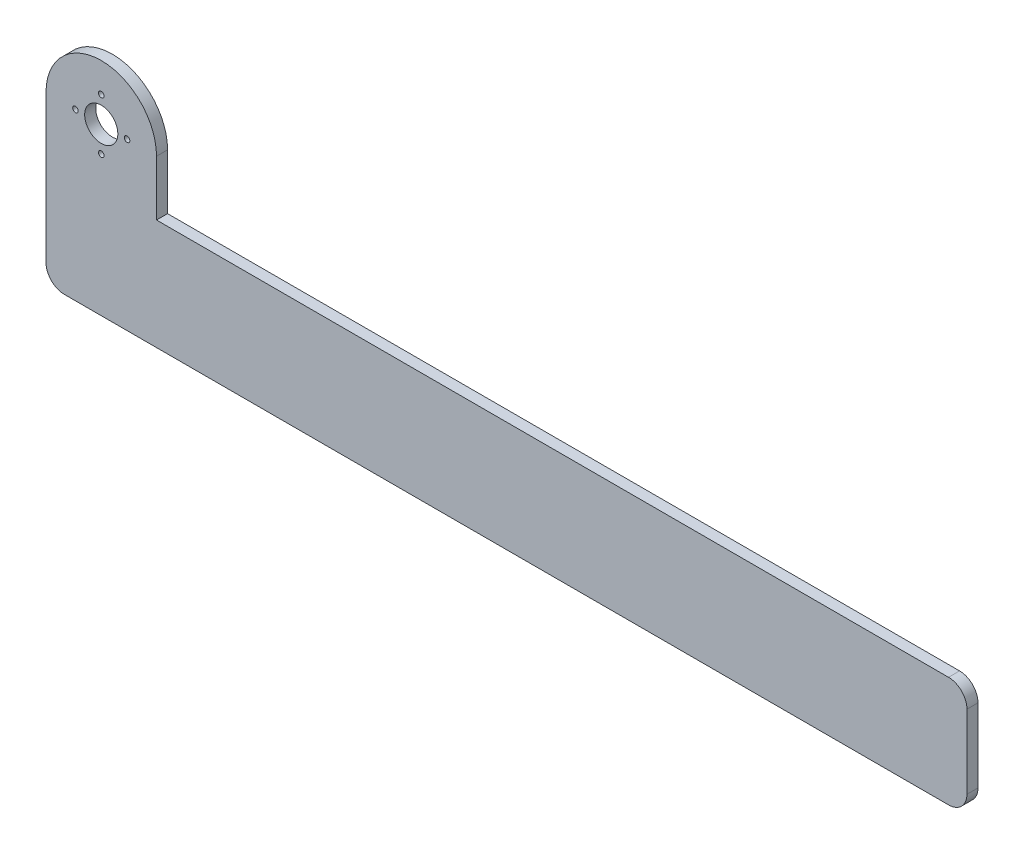
ISO-10303-21;
HEADER;
FILE_DESCRIPTION(('STEP AP214'),'2;1');
FILE_NAME('part.step','',(''),(''),'','','');
FILE_SCHEMA(('AUTOMOTIVE_DESIGN { 1 0 10303 214 1 1 1 1 }'));
ENDSEC;
DATA;
#1=APPLICATION_CONTEXT('core data for automotive mechanical design processes');
#2=APPLICATION_PROTOCOL_DEFINITION('international standard','automotive_design',2000,#1);
#3=PRODUCT_CONTEXT('',#1,'mechanical');
#4=PRODUCT('Part','Part','',(#3));
#5=PRODUCT_RELATED_PRODUCT_CATEGORY('part','',(#4));
#6=PRODUCT_DEFINITION_FORMATION('','',#4);
#7=PRODUCT_DEFINITION_CONTEXT('part definition',#1,'design');
#8=PRODUCT_DEFINITION('design','',#6,#7);
#9=PRODUCT_DEFINITION_SHAPE('','',#8);
#10=(LENGTH_UNIT() NAMED_UNIT(*) SI_UNIT(.MILLI.,.METRE.));
#11=(NAMED_UNIT(*) PLANE_ANGLE_UNIT() SI_UNIT($,.RADIAN.));
#12=(NAMED_UNIT(*) SI_UNIT($,.STERADIAN.) SOLID_ANGLE_UNIT());
#13=UNCERTAINTY_MEASURE_WITH_UNIT(LENGTH_MEASURE(1.E-05),#10,'distance_accuracy_value','');
#14=(GEOMETRIC_REPRESENTATION_CONTEXT(3) GLOBAL_UNCERTAINTY_ASSIGNED_CONTEXT((#13)) GLOBAL_UNIT_ASSIGNED_CONTEXT((#10,
#11,#12)) REPRESENTATION_CONTEXT('',''));
#15=CARTESIAN_POINT('',(0.,0.,0.));
#16=DIRECTION('',(0.,0.,1.));
#17=DIRECTION('',(1.,0.,0.));
#18=AXIS2_PLACEMENT_3D('',#15,#16,#17);
#19=CARTESIAN_POINT('',(30.,-45.,6.));
#20=DIRECTION('',(0.,1.,0.));
#21=DIRECTION('',(-1.,0.,0.));
#22=AXIS2_PLACEMENT_3D('',#19,#20,#21);
#23=PLANE('',#22);
#24=DIRECTION('',(1.,0.,0.));
#25=VECTOR('',#24,1.);
#26=CARTESIAN_POINT('',(30.,-45.,0.));
#27=LINE('',#26,#25);
#28=CARTESIAN_POINT('',(-20.,-45.,0.));
#29=VERTEX_POINT('',#28);
#30=CARTESIAN_POINT('',(460.,-45.,0.));
#31=VERTEX_POINT('',#30);
#32=EDGE_CURVE('E140',#29,#31,#27,.T.);
#33=ORIENTED_EDGE('',*,*,#32,.T.);
#34=DIRECTION('',(0.,0.,-1.));
#35=VECTOR('',#34,1.);
#36=CARTESIAN_POINT('',(460.,-45.,6.));
#37=LINE('',#36,#35);
#38=CARTESIAN_POINT('',(460.,-45.0000000000001,6.));
#39=VERTEX_POINT('',#38);
#40=EDGE_CURVE('E60',#31,#39,#37,.F.);
#41=ORIENTED_EDGE('',*,*,#40,.T.);
#42=DIRECTION('',(1.,0.,0.));
#43=VECTOR('',#42,1.);
#44=CARTESIAN_POINT('',(-30.,-45.,6.));
#45=LINE('',#44,#43);
#46=CARTESIAN_POINT('',(-20.,-45.,6.));
#47=VERTEX_POINT('',#46);
#48=EDGE_CURVE('E154',#47,#39,#45,.T.);
#49=ORIENTED_EDGE('',*,*,#48,.F.);
#50=DIRECTION('',(0.,0.,-1.));
#51=VECTOR('',#50,1.);
#52=CARTESIAN_POINT('',(-20.,-45.,6.));
#53=LINE('',#52,#51);
#54=EDGE_CURVE('E125',#47,#29,#53,.T.);
#55=ORIENTED_EDGE('',*,*,#54,.T.);
#56=EDGE_LOOP('',(#33,#41,#49,#55));
#57=FACE_BOUND('',#56,.T.);
#58=ADVANCED_FACE('F37',(#57),#23,.F.);
#59=CARTESIAN_POINT('',(470.,-45.,6.));
#60=DIRECTION('',(-1.,0.,0.));
#61=DIRECTION('',(0.,0.,1.));
#62=AXIS2_PLACEMENT_3D('',#59,#60,#61);
#63=PLANE('',#62);
#64=DIRECTION('',(0.,1.,0.));
#65=VECTOR('',#64,1.);
#66=CARTESIAN_POINT('',(470.,-45.,6.));
#67=LINE('',#66,#65);
#68=CARTESIAN_POINT('',(470.,-35.,6.));
#69=VERTEX_POINT('',#68);
#70=CARTESIAN_POINT('',(470.,5.,6.));
#71=VERTEX_POINT('',#70);
#72=EDGE_CURVE('E116',#69,#71,#67,.T.);
#73=ORIENTED_EDGE('',*,*,#72,.F.);
#74=DIRECTION('',(0.,0.,-1.));
#75=VECTOR('',#74,1.);
#76=CARTESIAN_POINT('',(470.,-35.,6.));
#77=LINE('',#76,#75);
#78=CARTESIAN_POINT('',(470.,-35.,0.));
#79=VERTEX_POINT('',#78);
#80=EDGE_CURVE('E168',#69,#79,#77,.T.);
#81=ORIENTED_EDGE('',*,*,#80,.T.);
#82=DIRECTION('',(0.,1.,0.));
#83=VECTOR('',#82,1.);
#84=CARTESIAN_POINT('',(470.,-45.,0.));
#85=LINE('',#84,#83);
#86=CARTESIAN_POINT('',(470.,5.,0.));
#87=VERTEX_POINT('',#86);
#88=EDGE_CURVE('E142',#79,#87,#85,.T.);
#89=ORIENTED_EDGE('',*,*,#88,.T.);
#90=DIRECTION('',(0.,0.,-1.));
#91=VECTOR('',#90,1.);
#92=CARTESIAN_POINT('',(470.,5.,6.));
#93=LINE('',#92,#91);
#94=EDGE_CURVE('E166',#87,#71,#93,.F.);
#95=ORIENTED_EDGE('',*,*,#94,.T.);
#96=EDGE_LOOP('',(#73,#81,#89,#95));
#97=FACE_BOUND('',#96,.T.);
#98=ADVANCED_FACE('F181',(#97),#63,.F.);
#99=CARTESIAN_POINT('',(470.,15.,6.));
#100=DIRECTION('',(0.,-1.,0.));
#101=DIRECTION('',(1.,0.,0.));
#102=AXIS2_PLACEMENT_3D('',#99,#100,#101);
#103=PLANE('',#102);
#104=DIRECTION('',(-1.,0.,0.));
#105=VECTOR('',#104,1.);
#106=CARTESIAN_POINT('',(470.,15.,6.));
#107=LINE('',#106,#105);
#108=CARTESIAN_POINT('',(460.,15.,6.));
#109=VERTEX_POINT('',#108);
#110=CARTESIAN_POINT('',(30.,15.,6.));
#111=VERTEX_POINT('',#110);
#112=EDGE_CURVE('E108',#109,#111,#107,.T.);
#113=ORIENTED_EDGE('',*,*,#112,.F.);
#114=DIRECTION('',(0.,0.,-1.));
#115=VECTOR('',#114,1.);
#116=CARTESIAN_POINT('',(460.,15.,6.));
#117=LINE('',#116,#115);
#118=CARTESIAN_POINT('',(460.,15.,0.));
#119=VERTEX_POINT('',#118);
#120=EDGE_CURVE('E11',#109,#119,#117,.T.);
#121=ORIENTED_EDGE('',*,*,#120,.T.);
#122=DIRECTION('',(-1.,0.,0.));
#123=VECTOR('',#122,1.);
#124=CARTESIAN_POINT('',(470.,15.,0.));
#125=LINE('',#124,#123);
#126=CARTESIAN_POINT('',(30.,15.,0.));
#127=VERTEX_POINT('',#126);
#128=EDGE_CURVE('E122',#119,#127,#125,.T.);
#129=ORIENTED_EDGE('',*,*,#128,.T.);
#130=DIRECTION('',(0.,0.,-1.));
#131=VECTOR('',#130,1.);
#132=CARTESIAN_POINT('',(30.,15.,6.));
#133=LINE('',#132,#131);
#134=EDGE_CURVE('E119',#111,#127,#133,.T.);
#135=ORIENTED_EDGE('',*,*,#134,.F.);
#136=EDGE_LOOP('',(#113,#121,#129,#135));
#137=FACE_BOUND('',#136,.T.);
#138=ADVANCED_FACE('F120',(#137),#103,.F.);
#139=CARTESIAN_POINT('',(30.,45.,6.));
#140=DIRECTION('',(-1.,0.,0.));
#141=DIRECTION('',(0.,-1.,0.));
#142=AXIS2_PLACEMENT_3D('',#139,#140,#141);
#143=PLANE('',#142);
#144=DIRECTION('',(0.,1.,0.));
#145=VECTOR('',#144,1.);
#146=CARTESIAN_POINT('',(30.,45.,0.));
#147=LINE('',#146,#145);
#148=CARTESIAN_POINT('',(30.,45.,0.));
#149=VERTEX_POINT('',#148);
#150=EDGE_CURVE('E147',#127,#149,#147,.T.);
#151=ORIENTED_EDGE('',*,*,#150,.T.);
#152=DIRECTION('',(0.,0.,-1.));
#153=VECTOR('',#152,1.);
#154=CARTESIAN_POINT('',(30.,45.,6.));
#155=LINE('',#154,#153);
#156=CARTESIAN_POINT('',(30.,45.,6.));
#157=VERTEX_POINT('',#156);
#158=EDGE_CURVE('E126',#157,#149,#155,.T.);
#159=ORIENTED_EDGE('',*,*,#158,.F.);
#160=DIRECTION('',(0.,1.,0.));
#161=VECTOR('',#160,1.);
#162=CARTESIAN_POINT('',(30.,45.,6.));
#163=LINE('',#162,#161);
#164=EDGE_CURVE('E112',#111,#157,#163,.T.);
#165=ORIENTED_EDGE('',*,*,#164,.F.);
#166=ORIENTED_EDGE('',*,*,#134,.T.);
#167=EDGE_LOOP('',(#151,#159,#165,#166));
#168=FACE_BOUND('',#167,.T.);
#169=ADVANCED_FACE('F128',(#168),#143,.F.);
#170=CARTESIAN_POINT('',(0.,45.,6.));
#171=DIRECTION('',(0.,0.,-1.));
#172=DIRECTION('',(-1.,0.,0.));
#173=AXIS2_PLACEMENT_3D('',#170,#171,#172);
#174=CYLINDRICAL_SURFACE('',#173,30.);
#175=CARTESIAN_POINT('',(0.,45.,0.));
#176=DIRECTION('',(0.,0.,1.));
#177=DIRECTION('',(-1.,0.,0.));
#178=AXIS2_PLACEMENT_3D('',#175,#176,#177);
#179=CIRCLE('',#178,30.);
#180=CARTESIAN_POINT('',(-30.,45.,0.));
#181=VERTEX_POINT('',#180);
#182=EDGE_CURVE('E149',#149,#181,#179,.T.);
#183=ORIENTED_EDGE('',*,*,#182,.T.);
#184=DIRECTION('',(0.,0.,-1.));
#185=VECTOR('',#184,1.);
#186=CARTESIAN_POINT('',(-30.,45.,6.));
#187=LINE('',#186,#185);
#188=CARTESIAN_POINT('',(-30.,45.,6.));
#189=VERTEX_POINT('',#188);
#190=EDGE_CURVE('E139',#189,#181,#187,.T.);
#191=ORIENTED_EDGE('',*,*,#190,.F.);
#192=CARTESIAN_POINT('',(0.,45.,6.));
#193=DIRECTION('',(0.,0.,1.));
#194=DIRECTION('',(-1.,0.,0.));
#195=AXIS2_PLACEMENT_3D('',#192,#193,#194);
#196=CIRCLE('',#195,30.);
#197=EDGE_CURVE('E131',#157,#189,#196,.T.);
#198=ORIENTED_EDGE('',*,*,#197,.F.);
#199=ORIENTED_EDGE('',*,*,#158,.T.);
#200=EDGE_LOOP('',(#183,#191,#198,#199));
#201=FACE_BOUND('',#200,.T.);
#202=ADVANCED_FACE('F200',(#201),#174,.T.);
#203=CARTESIAN_POINT('',(-30.,45.,6.));
#204=DIRECTION('',(1.,0.,0.));
#205=DIRECTION('',(0.,1.,0.));
#206=AXIS2_PLACEMENT_3D('',#203,#204,#205);
#207=PLANE('',#206);
#208=DIRECTION('',(0.,-1.,0.));
#209=VECTOR('',#208,1.);
#210=CARTESIAN_POINT('',(-30.,45.,0.));
#211=LINE('',#210,#209);
#212=CARTESIAN_POINT('',(-30.,-35.,0.));
#213=VERTEX_POINT('',#212);
#214=EDGE_CURVE('E151',#181,#213,#211,.T.);
#215=ORIENTED_EDGE('',*,*,#214,.T.);
#216=DIRECTION('',(0.,0.,-1.));
#217=VECTOR('',#216,1.);
#218=CARTESIAN_POINT('',(-30.,-35.,6.));
#219=LINE('',#218,#217);
#220=CARTESIAN_POINT('',(-30.,-35.,6.));
#221=VERTEX_POINT('',#220);
#222=EDGE_CURVE('E162',#213,#221,#219,.F.);
#223=ORIENTED_EDGE('',*,*,#222,.T.);
#224=DIRECTION('',(0.,-1.,0.));
#225=VECTOR('',#224,1.);
#226=CARTESIAN_POINT('',(-30.,45.,6.));
#227=LINE('',#226,#225);
#228=EDGE_CURVE('E133',#189,#221,#227,.T.);
#229=ORIENTED_EDGE('',*,*,#228,.F.);
#230=ORIENTED_EDGE('',*,*,#190,.T.);
#231=EDGE_LOOP('',(#215,#223,#229,#230));
#232=FACE_BOUND('',#231,.T.);
#233=ADVANCED_FACE('F196',(#232),#207,.F.);
#234=CARTESIAN_POINT('',(0.,45.,6.));
#235=DIRECTION('',(0.,0.,-1.));
#236=DIRECTION('',(-1.,0.,0.));
#237=AXIS2_PLACEMENT_3D('',#234,#235,#236);
#238=PLANE('',#237);
#239=CARTESIAN_POINT('',(0.,31.,6.));
#240=DIRECTION('',(0.,0.,1.));
#241=DIRECTION('',(1.,0.,0.));
#242=AXIS2_PLACEMENT_3D('',#239,#240,#241);
#243=CIRCLE('',#242,1.5);
#244=CARTESIAN_POINT('',(1.5,31.,6.));
#245=VERTEX_POINT('',#244);
#246=EDGE_CURVE('E381',#245,#245,#243,.T.);
#247=ORIENTED_EDGE('',*,*,#246,.F.);
#248=EDGE_LOOP('',(#247));
#249=FACE_BOUND('',#248,.T.);
#250=CARTESIAN_POINT('',(14.,45.,6.));
#251=DIRECTION('',(0.,0.,1.));
#252=DIRECTION('',(1.,0.,0.));
#253=AXIS2_PLACEMENT_3D('',#250,#251,#252);
#254=CIRCLE('',#253,1.5);
#255=CARTESIAN_POINT('',(15.5,45.,6.));
#256=VERTEX_POINT('',#255);
#257=EDGE_CURVE('E382',#256,#256,#254,.T.);
#258=ORIENTED_EDGE('',*,*,#257,.F.);
#259=EDGE_LOOP('',(#258));
#260=FACE_BOUND('',#259,.T.);
#261=CARTESIAN_POINT('',(0.,59.,6.));
#262=DIRECTION('',(0.,0.,1.));
#263=DIRECTION('',(1.,0.,0.));
#264=AXIS2_PLACEMENT_3D('',#261,#262,#263);
#265=CIRCLE('',#264,1.5);
#266=CARTESIAN_POINT('',(1.5,59.,6.));
#267=VERTEX_POINT('',#266);
#268=EDGE_CURVE('E392',#267,#267,#265,.T.);
#269=ORIENTED_EDGE('',*,*,#268,.F.);
#270=EDGE_LOOP('',(#269));
#271=FACE_BOUND('',#270,.T.);
#272=CARTESIAN_POINT('',(-14.,45.,6.));
#273=DIRECTION('',(0.,0.,1.));
#274=DIRECTION('',(1.,0.,0.));
#275=AXIS2_PLACEMENT_3D('',#272,#273,#274);
#276=CIRCLE('',#275,1.5);
#277=CARTESIAN_POINT('',(-12.5,45.,6.));
#278=VERTEX_POINT('',#277);
#279=EDGE_CURVE('E398',#278,#278,#276,.T.);
#280=ORIENTED_EDGE('',*,*,#279,.F.);
#281=EDGE_LOOP('',(#280));
#282=FACE_BOUND('',#281,.T.);
#283=CARTESIAN_POINT('',(0.,45.,6.));
#284=DIRECTION('',(0.,0.,1.));
#285=DIRECTION('',(1.,0.,0.));
#286=AXIS2_PLACEMENT_3D('',#283,#284,#285);
#287=CIRCLE('',#286,9.);
#288=CARTESIAN_POINT('',(8.99999999999999,45.,6.));
#289=VERTEX_POINT('',#288);
#290=EDGE_CURVE('E384',#289,#289,#287,.T.);
#291=ORIENTED_EDGE('',*,*,#290,.F.);
#292=EDGE_LOOP('',(#291));
#293=FACE_BOUND('',#292,.T.);
#294=ORIENTED_EDGE('',*,*,#48,.T.);
#295=CARTESIAN_POINT('',(460.,-35.,6.));
#296=DIRECTION('',(0.,0.,-1.));
#297=DIRECTION('',(-1.,0.,0.));
#298=AXIS2_PLACEMENT_3D('',#295,#296,#297);
#299=CIRCLE('',#298,10.);
#300=EDGE_CURVE('E45',#39,#69,#299,.F.);
#301=ORIENTED_EDGE('',*,*,#300,.T.);
#302=ORIENTED_EDGE('',*,*,#72,.T.);
#303=CARTESIAN_POINT('',(460.,5.,6.));
#304=DIRECTION('',(0.,0.,-1.));
#305=DIRECTION('',(-1.,0.,0.));
#306=AXIS2_PLACEMENT_3D('',#303,#304,#305);
#307=CIRCLE('',#306,10.);
#308=EDGE_CURVE('E52',#71,#109,#307,.F.);
#309=ORIENTED_EDGE('',*,*,#308,.T.);
#310=ORIENTED_EDGE('',*,*,#112,.T.);
#311=ORIENTED_EDGE('',*,*,#164,.T.);
#312=ORIENTED_EDGE('',*,*,#197,.T.);
#313=ORIENTED_EDGE('',*,*,#228,.T.);
#314=CARTESIAN_POINT('',(-20.,-35.,6.));
#315=DIRECTION('',(0.,0.,-1.));
#316=DIRECTION('',(-1.,0.,0.));
#317=AXIS2_PLACEMENT_3D('',#314,#315,#316);
#318=CIRCLE('',#317,10.);
#319=EDGE_CURVE('E164',#221,#47,#318,.F.);
#320=ORIENTED_EDGE('',*,*,#319,.T.);
#321=EDGE_LOOP('',(#294,#301,#302,#309,#310,#311,#312,#313,#320));
#322=FACE_BOUND('',#321,.T.);
#323=ADVANCED_FACE('F110',(#249,#260,#271,#282,#293,#322),#238,.F.);
#324=CARTESIAN_POINT('',(0.,45.,0.));
#325=DIRECTION('',(0.,0.,-1.));
#326=DIRECTION('',(-1.,0.,0.));
#327=AXIS2_PLACEMENT_3D('',#324,#325,#326);
#328=PLANE('',#327);
#329=CARTESIAN_POINT('',(0.,31.,0.));
#330=DIRECTION('',(0.,0.,1.));
#331=DIRECTION('',(1.,0.,0.));
#332=AXIS2_PLACEMENT_3D('',#329,#330,#331);
#333=CIRCLE('',#332,1.5);
#334=CARTESIAN_POINT('',(1.5,31.,0.));
#335=VERTEX_POINT('',#334);
#336=EDGE_CURVE('E378',#335,#335,#333,.T.);
#337=ORIENTED_EDGE('',*,*,#336,.T.);
#338=EDGE_LOOP('',(#337));
#339=FACE_BOUND('',#338,.T.);
#340=CARTESIAN_POINT('',(14.,45.,0.));
#341=DIRECTION('',(0.,0.,1.));
#342=DIRECTION('',(1.,0.,0.));
#343=AXIS2_PLACEMENT_3D('',#340,#341,#342);
#344=CIRCLE('',#343,1.5);
#345=CARTESIAN_POINT('',(15.5,45.,0.));
#346=VERTEX_POINT('',#345);
#347=EDGE_CURVE('E387',#346,#346,#344,.T.);
#348=ORIENTED_EDGE('',*,*,#347,.T.);
#349=EDGE_LOOP('',(#348));
#350=FACE_BOUND('',#349,.T.);
#351=CARTESIAN_POINT('',(0.,59.,0.));
#352=DIRECTION('',(0.,0.,1.));
#353=DIRECTION('',(1.,0.,0.));
#354=AXIS2_PLACEMENT_3D('',#351,#352,#353);
#355=CIRCLE('',#354,1.5);
#356=CARTESIAN_POINT('',(1.5,59.,0.));
#357=VERTEX_POINT('',#356);
#358=EDGE_CURVE('E395',#357,#357,#355,.T.);
#359=ORIENTED_EDGE('',*,*,#358,.T.);
#360=EDGE_LOOP('',(#359));
#361=FACE_BOUND('',#360,.T.);
#362=CARTESIAN_POINT('',(-14.,45.,0.));
#363=DIRECTION('',(0.,0.,1.));
#364=DIRECTION('',(1.,0.,0.));
#365=AXIS2_PLACEMENT_3D('',#362,#363,#364);
#366=CIRCLE('',#365,1.5);
#367=CARTESIAN_POINT('',(-12.5,45.,0.));
#368=VERTEX_POINT('',#367);
#369=EDGE_CURVE('E401',#368,#368,#366,.T.);
#370=ORIENTED_EDGE('',*,*,#369,.T.);
#371=EDGE_LOOP('',(#370));
#372=FACE_BOUND('',#371,.T.);
#373=CARTESIAN_POINT('',(0.,45.,0.));
#374=DIRECTION('',(0.,0.,1.));
#375=DIRECTION('',(1.,0.,0.));
#376=AXIS2_PLACEMENT_3D('',#373,#374,#375);
#377=CIRCLE('',#376,9.);
#378=CARTESIAN_POINT('',(8.99999999999999,45.,0.));
#379=VERTEX_POINT('',#378);
#380=EDGE_CURVE('E143',#379,#379,#377,.T.);
#381=ORIENTED_EDGE('',*,*,#380,.T.);
#382=EDGE_LOOP('',(#381));
#383=FACE_BOUND('',#382,.T.);
#384=ORIENTED_EDGE('',*,*,#88,.F.);
#385=CARTESIAN_POINT('',(460.,-35.,0.));
#386=DIRECTION('',(0.,0.,-1.));
#387=DIRECTION('',(-1.,0.,0.));
#388=AXIS2_PLACEMENT_3D('',#385,#386,#387);
#389=CIRCLE('',#388,10.);
#390=EDGE_CURVE('E173',#79,#31,#389,.T.);
#391=ORIENTED_EDGE('',*,*,#390,.T.);
#392=ORIENTED_EDGE('',*,*,#32,.F.);
#393=CARTESIAN_POINT('',(-20.,-35.,0.));
#394=DIRECTION('',(0.,0.,-1.));
#395=DIRECTION('',(-1.,0.,0.));
#396=AXIS2_PLACEMENT_3D('',#393,#394,#395);
#397=CIRCLE('',#396,10.);
#398=EDGE_CURVE('E160',#29,#213,#397,.T.);
#399=ORIENTED_EDGE('',*,*,#398,.T.);
#400=ORIENTED_EDGE('',*,*,#214,.F.);
#401=ORIENTED_EDGE('',*,*,#182,.F.);
#402=ORIENTED_EDGE('',*,*,#150,.F.);
#403=ORIENTED_EDGE('',*,*,#128,.F.);
#404=CARTESIAN_POINT('',(460.,5.,0.));
#405=DIRECTION('',(0.,0.,-1.));
#406=DIRECTION('',(-1.,0.,0.));
#407=AXIS2_PLACEMENT_3D('',#404,#405,#406);
#408=CIRCLE('',#407,10.);
#409=EDGE_CURVE('E171',#119,#87,#408,.T.);
#410=ORIENTED_EDGE('',*,*,#409,.T.);
#411=EDGE_LOOP('',(#384,#391,#392,#399,#400,#401,#402,#403,#410));
#412=FACE_BOUND('',#411,.T.);
#413=ADVANCED_FACE('F187',(#339,#350,#361,#372,#383,#412),#328,.T.);
#414=CARTESIAN_POINT('',(-20.,-35.,6.));
#415=DIRECTION('',(0.,0.,-1.));
#416=DIRECTION('',(-1.,0.,0.));
#417=AXIS2_PLACEMENT_3D('',#414,#415,#416);
#418=CYLINDRICAL_SURFACE('',#417,10.);
#419=ORIENTED_EDGE('',*,*,#319,.F.);
#420=ORIENTED_EDGE('',*,*,#222,.F.);
#421=ORIENTED_EDGE('',*,*,#398,.F.);
#422=ORIENTED_EDGE('',*,*,#54,.F.);
#423=EDGE_LOOP('',(#419,#420,#421,#422));
#424=FACE_BOUND('',#423,.T.);
#425=ADVANCED_FACE('F191',(#424),#418,.T.);
#426=CARTESIAN_POINT('',(460.,-35.,6.));
#427=DIRECTION('',(0.,0.,-1.));
#428=DIRECTION('',(-1.,0.,0.));
#429=AXIS2_PLACEMENT_3D('',#426,#427,#428);
#430=CYLINDRICAL_SURFACE('',#429,10.);
#431=ORIENTED_EDGE('',*,*,#300,.F.);
#432=ORIENTED_EDGE('',*,*,#40,.F.);
#433=ORIENTED_EDGE('',*,*,#390,.F.);
#434=ORIENTED_EDGE('',*,*,#80,.F.);
#435=EDGE_LOOP('',(#431,#432,#433,#434));
#436=FACE_BOUND('',#435,.T.);
#437=ADVANCED_FACE('F184',(#436),#430,.T.);
#438=CARTESIAN_POINT('',(460.,5.,6.));
#439=DIRECTION('',(0.,0.,-1.));
#440=DIRECTION('',(-1.,0.,0.));
#441=AXIS2_PLACEMENT_3D('',#438,#439,#440);
#442=CYLINDRICAL_SURFACE('',#441,10.);
#443=ORIENTED_EDGE('',*,*,#308,.F.);
#444=ORIENTED_EDGE('',*,*,#94,.F.);
#445=ORIENTED_EDGE('',*,*,#409,.F.);
#446=ORIENTED_EDGE('',*,*,#120,.F.);
#447=EDGE_LOOP('',(#443,#444,#445,#446));
#448=FACE_BOUND('',#447,.T.);
#449=ADVANCED_FACE('F39',(#448),#442,.T.);
#450=CARTESIAN_POINT('',(0.,45.,0.));
#451=DIRECTION('',(0.,0.,1.));
#452=DIRECTION('',(1.,0.,0.));
#453=AXIS2_PLACEMENT_3D('',#450,#451,#452);
#454=CYLINDRICAL_SURFACE('',#453,9.);
#455=ORIENTED_EDGE('',*,*,#380,.F.);
#456=EDGE_LOOP('',(#455));
#457=FACE_BOUND('',#456,.T.);
#458=ORIENTED_EDGE('',*,*,#290,.T.);
#459=EDGE_LOOP('',(#458));
#460=FACE_BOUND('',#459,.T.);
#461=ADVANCED_FACE('F203',(#457,#460),#454,.F.);
#462=CARTESIAN_POINT('',(-14.,45.,0.));
#463=DIRECTION('',(0.,0.,1.));
#464=DIRECTION('',(1.,0.,0.));
#465=AXIS2_PLACEMENT_3D('',#462,#463,#464);
#466=CYLINDRICAL_SURFACE('',#465,1.5);
#467=ORIENTED_EDGE('',*,*,#369,.F.);
#468=EDGE_LOOP('',(#467));
#469=FACE_BOUND('',#468,.T.);
#470=ORIENTED_EDGE('',*,*,#279,.T.);
#471=EDGE_LOOP('',(#470));
#472=FACE_BOUND('',#471,.T.);
#473=ADVANCED_FACE('F208',(#469,#472),#466,.F.);
#474=CARTESIAN_POINT('',(0.,59.,0.));
#475=DIRECTION('',(0.,0.,1.));
#476=DIRECTION('',(1.,0.,0.));
#477=AXIS2_PLACEMENT_3D('',#474,#475,#476);
#478=CYLINDRICAL_SURFACE('',#477,1.5);
#479=ORIENTED_EDGE('',*,*,#358,.F.);
#480=EDGE_LOOP('',(#479));
#481=FACE_BOUND('',#480,.T.);
#482=ORIENTED_EDGE('',*,*,#268,.T.);
#483=EDGE_LOOP('',(#482));
#484=FACE_BOUND('',#483,.T.);
#485=ADVANCED_FACE('F279',(#481,#484),#478,.F.);
#486=CARTESIAN_POINT('',(14.,45.,0.));
#487=DIRECTION('',(0.,0.,1.));
#488=DIRECTION('',(1.,0.,0.));
#489=AXIS2_PLACEMENT_3D('',#486,#487,#488);
#490=CYLINDRICAL_SURFACE('',#489,1.5);
#491=ORIENTED_EDGE('',*,*,#347,.F.);
#492=EDGE_LOOP('',(#491));
#493=FACE_BOUND('',#492,.T.);
#494=ORIENTED_EDGE('',*,*,#257,.T.);
#495=EDGE_LOOP('',(#494));
#496=FACE_BOUND('',#495,.T.);
#497=ADVANCED_FACE('F290',(#493,#496),#490,.F.);
#498=CARTESIAN_POINT('',(0.,31.,0.));
#499=DIRECTION('',(0.,0.,1.));
#500=DIRECTION('',(1.,0.,0.));
#501=AXIS2_PLACEMENT_3D('',#498,#499,#500);
#502=CYLINDRICAL_SURFACE('',#501,1.5);
#503=ORIENTED_EDGE('',*,*,#336,.F.);
#504=EDGE_LOOP('',(#503));
#505=FACE_BOUND('',#504,.T.);
#506=ORIENTED_EDGE('',*,*,#246,.T.);
#507=EDGE_LOOP('',(#506));
#508=FACE_BOUND('',#507,.T.);
#509=ADVANCED_FACE('F301',(#505,#508),#502,.F.);
#510=CLOSED_SHELL('',(#58,#98,#138,#169,#202,#233,#323,#413,#425,#437,#449,#461,#473,#485,#497,#509));
#511=MANIFOLD_SOLID_BREP('B2',#510);
#512=ADVANCED_BREP_SHAPE_REPRESENTATION('',(#18,#511),#14);
#513=SHAPE_DEFINITION_REPRESENTATION(#9,#512);
ENDSEC;
END-ISO-10303-21;
